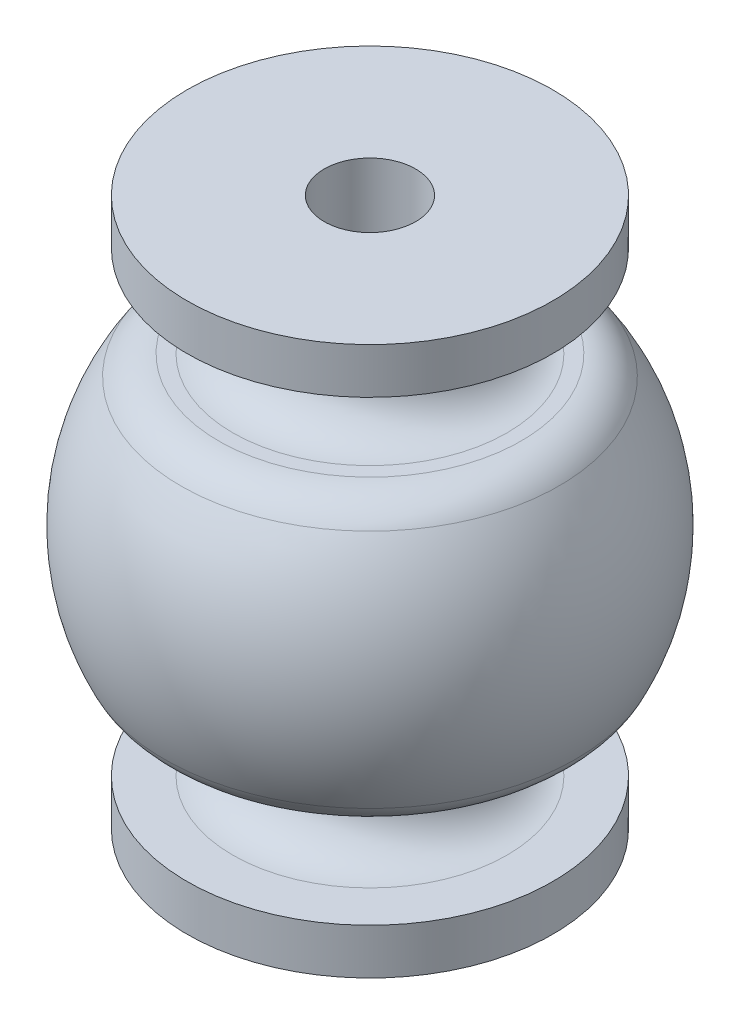
ISO-10303-21;
HEADER;
FILE_DESCRIPTION(('STEP AP214'),'2;1');
FILE_NAME('part.step','',(''),(''),'','','');
FILE_SCHEMA(('AUTOMOTIVE_DESIGN { 1 0 10303 214 1 1 1 1 }'));
ENDSEC;
DATA;
#1=APPLICATION_CONTEXT('core data for automotive mechanical design processes');
#2=APPLICATION_PROTOCOL_DEFINITION('international standard','automotive_design',2000,#1);
#3=PRODUCT_CONTEXT('',#1,'mechanical');
#4=PRODUCT('Part','Part','',(#3));
#5=PRODUCT_RELATED_PRODUCT_CATEGORY('part','',(#4));
#6=PRODUCT_DEFINITION_FORMATION('','',#4);
#7=PRODUCT_DEFINITION_CONTEXT('part definition',#1,'design');
#8=PRODUCT_DEFINITION('design','',#6,#7);
#9=PRODUCT_DEFINITION_SHAPE('','',#8);
#10=(LENGTH_UNIT() NAMED_UNIT(*) SI_UNIT(.MILLI.,.METRE.));
#11=(NAMED_UNIT(*) PLANE_ANGLE_UNIT() SI_UNIT($,.RADIAN.));
#12=(NAMED_UNIT(*) SI_UNIT($,.STERADIAN.) SOLID_ANGLE_UNIT());
#13=UNCERTAINTY_MEASURE_WITH_UNIT(LENGTH_MEASURE(1.E-05),#10,'distance_accuracy_value','');
#14=(GEOMETRIC_REPRESENTATION_CONTEXT(3) GLOBAL_UNCERTAINTY_ASSIGNED_CONTEXT((#13)) GLOBAL_UNIT_ASSIGNED_CONTEXT((#10,
#11,#12)) REPRESENTATION_CONTEXT('',''));
#15=CARTESIAN_POINT('',(0.,0.,0.));
#16=DIRECTION('',(0.,0.,1.));
#17=DIRECTION('',(1.,0.,0.));
#18=AXIS2_PLACEMENT_3D('',#15,#16,#17);
#19=CARTESIAN_POINT('',(0.,6.,0.));
#20=DIRECTION('',(0.,1.,0.));
#21=DIRECTION('',(-1.,0.,0.));
#22=AXIS2_PLACEMENT_3D('',#19,#20,#21);
#23=CYLINDRICAL_SURFACE('',#22,4.);
#24=CARTESIAN_POINT('',(0.,5.,0.));
#25=DIRECTION('',(0.,1.,0.));
#26=DIRECTION('',(-1.,0.,0.));
#27=AXIS2_PLACEMENT_3D('',#24,#25,#26);
#28=CIRCLE('',#27,4.);
#29=CARTESIAN_POINT('',(-4.,5.,0.));
#30=VERTEX_POINT('',#29);
#31=EDGE_CURVE('E128',#30,#30,#28,.T.);
#32=ORIENTED_EDGE('',*,*,#31,.T.);
#33=EDGE_LOOP('',(#32));
#34=FACE_BOUND('',#33,.T.);
#35=CARTESIAN_POINT('',(0.,6.,0.));
#36=DIRECTION('',(0.,1.,0.));
#37=DIRECTION('',(-1.,0.,0.));
#38=AXIS2_PLACEMENT_3D('',#35,#36,#37);
#39=CIRCLE('',#38,4.);
#40=CARTESIAN_POINT('',(-4.,6.,0.));
#41=VERTEX_POINT('',#40);
#42=EDGE_CURVE('E59',#41,#41,#39,.T.);
#43=ORIENTED_EDGE('',*,*,#42,.F.);
#44=EDGE_LOOP('',(#43));
#45=FACE_BOUND('',#44,.T.);
#46=ADVANCED_FACE('F41',(#34,#45),#23,.T.);
#47=CARTESIAN_POINT('',(0.,5.,0.));
#48=DIRECTION('',(0.,-1.,0.));
#49=DIRECTION('',(1.,0.,0.));
#50=AXIS2_PLACEMENT_3D('',#47,#48,#49);
#51=PLANE('',#50);
#52=CARTESIAN_POINT('',(0.,5.,0.));
#53=DIRECTION('',(0.,-1.,0.));
#54=DIRECTION('',(1.,0.,0.));
#55=AXIS2_PLACEMENT_3D('',#52,#53,#54);
#56=CIRCLE('',#55,3.);
#57=CARTESIAN_POINT('',(3.,5.,0.));
#58=VERTEX_POINT('',#57);
#59=EDGE_CURVE('E10',#58,#58,#56,.F.);
#60=ORIENTED_EDGE('',*,*,#59,.T.);
#61=EDGE_LOOP('',(#60));
#62=FACE_BOUND('',#61,.T.);
#63=ORIENTED_EDGE('',*,*,#31,.F.);
#64=EDGE_LOOP('',(#63));
#65=FACE_BOUND('',#64,.T.);
#66=ADVANCED_FACE('F82',(#62,#65),#51,.T.);
#67=CARTESIAN_POINT('',(0.,3.,0.));
#68=DIRECTION('',(0.,1.,0.));
#69=DIRECTION('',(-1.,0.,0.));
#70=AXIS2_PLACEMENT_3D('',#67,#68,#69);
#71=PLANE('',#70);
#72=CARTESIAN_POINT('',(0.,3.,0.));
#73=DIRECTION('',(0.,1.,0.));
#74=DIRECTION('',(-1.,0.,0.));
#75=AXIS2_PLACEMENT_3D('',#72,#73,#74);
#76=CIRCLE('',#75,3.3090727428555);
#77=CARTESIAN_POINT('',(-3.3090727428555,3.,0.));
#78=VERTEX_POINT('',#77);
#79=EDGE_CURVE('E49',#78,#78,#76,.T.);
#80=ORIENTED_EDGE('',*,*,#79,.T.);
#81=EDGE_LOOP('',(#80));
#82=FACE_BOUND('',#81,.T.);
#83=CARTESIAN_POINT('',(0.,3.,0.));
#84=DIRECTION('',(0.,1.,0.));
#85=DIRECTION('',(-1.,0.,0.));
#86=AXIS2_PLACEMENT_3D('',#83,#84,#85);
#87=CIRCLE('',#86,3.);
#88=CARTESIAN_POINT('',(-3.,3.,0.));
#89=VERTEX_POINT('',#88);
#90=EDGE_CURVE('E54',#89,#89,#87,.F.);
#91=ORIENTED_EDGE('',*,*,#90,.T.);
#92=EDGE_LOOP('',(#91));
#93=FACE_BOUND('',#92,.T.);
#94=ADVANCED_FACE('F88',(#82,#93),#71,.T.);
#95=CARTESIAN_POINT('',(0.,-0.247228867403314,0.));
#96=DIRECTION('',(0.,1.,0.));
#97=DIRECTION('',(-1.,0.,0.));
#98=AXIS2_PLACEMENT_3D('',#95,#96,#97);
#99=SPHERICAL_SURFACE('',#98,5.);
#100=CARTESIAN_POINT('',(0.,-2.43819278314917,0.));
#101=DIRECTION('',(0.,1.,0.));
#102=DIRECTION('',(-1.,0.,0.));
#103=AXIS2_PLACEMENT_3D('',#100,#101,#102);
#104=CIRCLE('',#103,4.49440509076558);
#105=CARTESIAN_POINT('',(-4.49440509076558,-2.43819278314917,0.));
#106=VERTEX_POINT('',#105);
#107=EDGE_CURVE('E113',#106,#106,#104,.T.);
#108=CARTESIAN_POINT('',(0.,2.56180721685083,0.));
#109=DIRECTION('',(0.,-1.,0.));
#110=DIRECTION('',(1.,0.,0.));
#111=AXIS2_PLACEMENT_3D('',#108,#109,#110);
#112=CIRCLE('',#111,4.13634092856937);
#113=CARTESIAN_POINT('',(-4.13634092856938,2.56180721685083,0.));
#114=VERTEX_POINT('',#113);
#115=EDGE_CURVE('E115',#114,#114,#112,.T.);
#116=CARTESIAN_POINT('',(-4.49440509076558,-2.43819278314917,0.));
#117=CARTESIAN_POINT('',(-4.51837263355739,-2.38902807033168,0.));
#118=CARTESIAN_POINT('',(-4.54153282449755,-2.33946980595294,0.));
#119=CARTESIAN_POINT('',(-4.58621495323902,-2.23962016517865,0.));
#120=CARTESIAN_POINT('',(-4.60773689104033,-2.1893287887831,0.));
#121=CARTESIAN_POINT('',(-4.64911896406856,-2.08806691508092,0.));
#122=CARTESIAN_POINT('',(-4.66897909929548,-2.03709641777429,0.));
#123=CARTESIAN_POINT('',(-4.7070162800247,-1.93453123622906,0.));
#124=CARTESIAN_POINT('',(-4.72519332552701,-1.88293655199047,0.));
#125=CARTESIAN_POINT('',(-4.75984472548355,-1.7791785460551,0.));
#126=CARTESIAN_POINT('',(-4.77631907993779,-1.72701522435832,0.));
#127=CARTESIAN_POINT('',(-4.80754736401386,-1.62217612052433,0.));
#128=CARTESIAN_POINT('',(-4.8223012936357,-1.56950033838713,0.));
#129=CARTESIAN_POINT('',(-4.85007283786525,-1.46369303848059,0.));
#130=CARTESIAN_POINT('',(-4.86309045247297,-1.41056152071124,0.));
#131=CARTESIAN_POINT('',(-4.8873753487379,-1.30389996621321,0.));
#132=CARTESIAN_POINT('',(-4.89864263039512,-1.25036992948451,0.));
#133=CARTESIAN_POINT('',(-4.91941472707402,-1.14296898260678,0.));
#134=CARTESIAN_POINT('',(-4.9289195420957,-1.08909807245774,0.));
#135=CARTESIAN_POINT('',(-4.94615646996424,-0.981073391437501,0.));
#136=CARTESIAN_POINT('',(-4.95388858281111,-0.926919620566298,0.));
#137=CARTESIAN_POINT('',(-4.9675717797372,-0.818387535386904,0.));
#138=CARTESIAN_POINT('',(-4.97352286381642,-0.764009221078713,0.));
#139=CARTESIAN_POINT('',(-4.98363759458702,-0.655086608123216,0.));
#140=CARTESIAN_POINT('',(-4.98780124127839,-0.600542309475909,0.));
#141=CARTESIAN_POINT('',(-4.99433661351114,-0.491346465684298,0.));
#142=CARTESIAN_POINT('',(-4.9967083390525,-0.436694920539994,0.));
#143=CARTESIAN_POINT('',(-4.99965731491388,-0.327343437088873,0.));
#144=CARTESIAN_POINT('',(-5.00023456523389,-0.272643498782055,0.));
#145=CARTESIAN_POINT('',(-4.99959396902129,-0.163254134454066,0.));
#146=CARTESIAN_POINT('',(-4.99837612248868,-0.108564708432895,0.));
#147=CARTESIAN_POINT('',(-4.9941466440494,0.000744737196115423,0.));
#148=CARTESIAN_POINT('',(-4.99113501214273,0.0553647568039547,0.));
#149=CARTESIAN_POINT('',(-4.98332120613134,0.164476570221228,0.));
#150=CARTESIAN_POINT('',(-4.97851903202661,0.218968364030663,0.));
#151=CARTESIAN_POINT('',(-4.96712931300004,0.327765044550271,0.));
#152=CARTESIAN_POINT('',(-4.96054176807819,0.382069931260444,0.));
#153=CARTESIAN_POINT('',(-4.94558840143424,0.490434317557792,0.));
#154=CARTESIAN_POINT('',(-4.93722257971214,0.544493817144966,0.));
#155=CARTESIAN_POINT('',(-4.91872166848116,0.652309213425902,0.));
#156=CARTESIAN_POINT('',(-4.90858657897228,0.706065110119663,0.));
#157=CARTESIAN_POINT('',(-4.88655804647583,0.813215411788092,0.));
#158=CARTESIAN_POINT('',(-4.87466460348827,0.866609816762759,0.));
#159=CARTESIAN_POINT('',(-4.84913217188484,0.972979635452232,0.));
#160=CARTESIAN_POINT('',(-4.83549318326898,1.02595504916704,0.));
#161=CARTESIAN_POINT('',(-4.8064843480051,1.13142983699872,0.));
#162=CARTESIAN_POINT('',(-4.79111450135709,1.1839292111156,0.));
#163=CARTESIAN_POINT('',(-4.75866050156871,1.28839538405979,0.));
#164=CARTESIAN_POINT('',(-4.74157634842836,1.34036218288711,0.));
#165=CARTESIAN_POINT('',(-4.7057121332597,1.44370724305453,0.));
#166=CARTESIAN_POINT('',(-4.68693207123139,1.49508550439463,0.));
#167=CARTESIAN_POINT('',(-4.64769626234913,1.59719816127853,0.));
#168=CARTESIAN_POINT('',(-4.62724051549517,1.64793255682234,0.));
#169=CARTESIAN_POINT('',(-4.5846753649362,1.74870284679067,0.));
#170=CARTESIAN_POINT('',(-4.5625659612312,1.79873874121518,0.));
#171=CARTESIAN_POINT('',(-4.51671730799666,1.89805814725261,0.));
#172=CARTESIAN_POINT('',(-4.49297805846712,1.94734165886553,0.));
#173=CARTESIAN_POINT('',(-4.44389527134232,2.04510322249201,0.));
#174=CARTESIAN_POINT('',(-4.41855173374705,2.09358127450557,0.));
#175=CARTESIAN_POINT('',(-4.36628768730966,2.18967972940066,0.));
#176=CARTESIAN_POINT('',(-4.33936717846753,2.23730013228218,0.));
#177=CARTESIAN_POINT('',(-4.28397808727426,2.33163194881601,0.));
#178=CARTESIAN_POINT('',(-4.25550950492311,2.37834336246833,0.));
#179=CARTESIAN_POINT('',(-4.1970552692949,2.47080711606262,0.));
#180=CARTESIAN_POINT('',(-4.16706961601784,2.51655945600459,0.));
#181=CARTESIAN_POINT('',(-4.13634092856938,2.56180721685083,0.));
#182=B_SPLINE_CURVE_WITH_KNOTS('',3,(#116,#117,#118,#119,#120,#121,#122,#123,#124,#125,#126,
#127,#128,#129,#130,#131,#132,#133,#134,#135,#136,#137,#138,#139,#140,#141,#142,#143,#144,#145,
#146,#147,#148,#149,#150,#151,#152,#153,#154,#155,#156,#157,#158,#159,#160,#161,#162,#163,#164,
#165,#166,#167,#168,#169,#170,#171,#172,#173,#174,#175,#176,#177,#178,#179,#180,#181),
.UNSPECIFIED.,.F.,.F.,(4,2,2,2,2,2,2,2,2,2,2,2,2,2,2,2,2,2,2,2,2,2,2,2,2,2,2,2,2,2,2,2,4),(0.,
0.164079497915561,0.328158995831123,0.492238493746684,0.656317991662244,0.820397489577806,
0.984476987493367,1.14855648540893,1.31263598332449,1.47671548124005,1.64079497915561,
1.80487447707117,1.96895397498673,2.13303347290229,2.29711297081786,2.46119246873342,
2.62527196664898,2.78935146456454,2.9534309624801,3.11751046039566,3.28158995831122,
3.44566945622678,3.60974895414235,3.77382845205791,3.93790794997347,4.10198744788903,
4.26606694580459,4.43014644372015,4.59422594163571,4.75830543955127,4.92238493746684,
5.0864644353824,5.25054393329796),.UNSPECIFIED.);
#183=EDGE_CURVE('BSEAM217',#106,#114,#182,.T.);
#184=ORIENTED_EDGE('',*,*,#107,.T.);
#185=ORIENTED_EDGE('',*,*,#115,.T.);
#186=ORIENTED_EDGE('',*,*,#183,.T.);
#187=ORIENTED_EDGE('',*,*,#183,.F.);
#188=EDGE_LOOP('',(#184,#186,#185,#187));
#189=FACE_BOUND('',#188,.T.);
#190=ADVANCED_FACE('F217',(#189),#99,.T.);
#191=CARTESIAN_POINT('',(0.,-3.,0.));
#192=DIRECTION('',(0.,1.,0.));
#193=DIRECTION('',(-1.,0.,0.));
#194=AXIS2_PLACEMENT_3D('',#191,#192,#193);
#195=PLANE('',#194);
#196=CARTESIAN_POINT('',(0.,-3.,0.));
#197=DIRECTION('',(0.,1.,0.));
#198=DIRECTION('',(-1.,0.,0.));
#199=AXIS2_PLACEMENT_3D('',#196,#197,#198);
#200=CIRCLE('',#199,3.);
#201=CARTESIAN_POINT('',(-3.,-3.,0.));
#202=VERTEX_POINT('',#201);
#203=EDGE_CURVE('E119',#202,#202,#200,.T.);
#204=ORIENTED_EDGE('',*,*,#203,.T.);
#205=EDGE_LOOP('',(#204));
#206=FACE_BOUND('',#205,.T.);
#207=CARTESIAN_POINT('',(0.,-3.,0.));
#208=DIRECTION('',(0.,1.,0.));
#209=DIRECTION('',(-1.,0.,0.));
#210=AXIS2_PLACEMENT_3D('',#207,#208,#209);
#211=CIRCLE('',#210,3.59552407261247);
#212=CARTESIAN_POINT('',(-3.59552407261247,-3.,0.));
#213=VERTEX_POINT('',#212);
#214=EDGE_CURVE('E110',#213,#213,#211,.F.);
#215=ORIENTED_EDGE('',*,*,#214,.T.);
#216=EDGE_LOOP('',(#215));
#217=FACE_BOUND('',#216,.T.);
#218=ADVANCED_FACE('F213',(#206,#217),#195,.F.);
#219=CARTESIAN_POINT('',(0.,-5.,0.));
#220=DIRECTION('',(0.,-1.,0.));
#221=DIRECTION('',(1.,0.,0.));
#222=AXIS2_PLACEMENT_3D('',#219,#220,#221);
#223=PLANE('',#222);
#224=CARTESIAN_POINT('',(0.,-5.,0.));
#225=DIRECTION('',(0.,-1.,0.));
#226=DIRECTION('',(1.,0.,0.));
#227=AXIS2_PLACEMENT_3D('',#224,#225,#226);
#228=CIRCLE('',#227,3.);
#229=CARTESIAN_POINT('',(3.,-5.,0.));
#230=VERTEX_POINT('',#229);
#231=EDGE_CURVE('E125',#230,#230,#228,.T.);
#232=ORIENTED_EDGE('',*,*,#231,.T.);
#233=EDGE_LOOP('',(#232));
#234=FACE_BOUND('',#233,.T.);
#235=CARTESIAN_POINT('',(0.,-5.,0.));
#236=DIRECTION('',(0.,1.,0.));
#237=DIRECTION('',(-1.,0.,0.));
#238=AXIS2_PLACEMENT_3D('',#235,#236,#237);
#239=CIRCLE('',#238,4.);
#240=CARTESIAN_POINT('',(-4.,-5.,0.));
#241=VERTEX_POINT('',#240);
#242=EDGE_CURVE('E130',#241,#241,#239,.T.);
#243=ORIENTED_EDGE('',*,*,#242,.T.);
#244=EDGE_LOOP('',(#243));
#245=FACE_BOUND('',#244,.T.);
#246=ADVANCED_FACE('F209',(#234,#245),#223,.F.);
#247=CARTESIAN_POINT('',(0.,6.,0.));
#248=DIRECTION('',(0.,1.,0.));
#249=DIRECTION('',(-1.,0.,0.));
#250=AXIS2_PLACEMENT_3D('',#247,#248,#249);
#251=CYLINDRICAL_SURFACE('',#250,4.);
#252=ORIENTED_EDGE('',*,*,#242,.F.);
#253=EDGE_LOOP('',(#252));
#254=FACE_BOUND('',#253,.T.);
#255=CARTESIAN_POINT('',(0.,-6.,0.));
#256=DIRECTION('',(0.,1.,0.));
#257=DIRECTION('',(-1.,0.,0.));
#258=AXIS2_PLACEMENT_3D('',#255,#256,#257);
#259=CIRCLE('',#258,4.);
#260=CARTESIAN_POINT('',(-4.,-6.,0.));
#261=VERTEX_POINT('',#260);
#262=EDGE_CURVE('E133',#261,#261,#259,.T.);
#263=ORIENTED_EDGE('',*,*,#262,.T.);
#264=EDGE_LOOP('',(#263));
#265=FACE_BOUND('',#264,.T.);
#266=ADVANCED_FACE('F205',(#254,#265),#251,.T.);
#267=CARTESIAN_POINT('',(0.,-6.,0.));
#268=DIRECTION('',(0.,-1.,0.));
#269=DIRECTION('',(1.,0.,0.));
#270=AXIS2_PLACEMENT_3D('',#267,#268,#269);
#271=PLANE('',#270);
#272=CARTESIAN_POINT('',(0.,-6.,0.));
#273=DIRECTION('',(0.,1.,0.));
#274=DIRECTION('',(-1.,0.,0.));
#275=AXIS2_PLACEMENT_3D('',#272,#273,#274);
#276=CIRCLE('',#275,1.);
#277=CARTESIAN_POINT('',(-1.,-6.,0.));
#278=VERTEX_POINT('',#277);
#279=EDGE_CURVE('E136',#278,#278,#276,.T.);
#280=ORIENTED_EDGE('',*,*,#279,.T.);
#281=EDGE_LOOP('',(#280));
#282=FACE_BOUND('',#281,.T.);
#283=ORIENTED_EDGE('',*,*,#262,.F.);
#284=EDGE_LOOP('',(#283));
#285=FACE_BOUND('',#284,.T.);
#286=ADVANCED_FACE('F201',(#282,#285),#271,.T.);
#287=CARTESIAN_POINT('',(0.,6.,0.));
#288=DIRECTION('',(0.,1.,0.));
#289=DIRECTION('',(-1.,0.,0.));
#290=AXIS2_PLACEMENT_3D('',#287,#288,#289);
#291=CYLINDRICAL_SURFACE('',#290,1.);
#292=CARTESIAN_POINT('',(0.,-5.14620835296967,0.));
#293=DIRECTION('',(0.,1.,0.));
#294=DIRECTION('',(-1.,0.,0.));
#295=AXIS2_PLACEMENT_3D('',#292,#293,#294);
#296=CIRCLE('',#295,1.);
#297=CARTESIAN_POINT('',(-1.,-5.14620835296967,0.));
#298=VERTEX_POINT('',#297);
#299=EDGE_CURVE('E139',#298,#298,#296,.T.);
#300=ORIENTED_EDGE('',*,*,#299,.T.);
#301=EDGE_LOOP('',(#300));
#302=FACE_BOUND('',#301,.T.);
#303=ORIENTED_EDGE('',*,*,#279,.F.);
#304=EDGE_LOOP('',(#303));
#305=FACE_BOUND('',#304,.T.);
#306=ADVANCED_FACE('F197',(#302,#305),#291,.F.);
#307=CARTESIAN_POINT('',(0.,-0.247228867403314,0.));
#308=DIRECTION('',(0.,1.,0.));
#309=DIRECTION('',(-1.,0.,0.));
#310=AXIS2_PLACEMENT_3D('',#307,#308,#309);
#311=SPHERICAL_SURFACE('',#310,5.);
#312=CARTESIAN_POINT('',(0.,-5.,0.));
#313=DIRECTION('',(0.,1.,0.));
#314=DIRECTION('',(-1.,0.,0.));
#315=AXIS2_PLACEMENT_3D('',#312,#313,#314);
#316=CIRCLE('',#315,1.55279314821893);
#317=CARTESIAN_POINT('',(-1.55279314821892,-5.,0.));
#318=VERTEX_POINT('',#317);
#319=EDGE_CURVE('E142',#318,#318,#316,.T.);
#320=CARTESIAN_POINT('',(-1.,-5.14620835296967,0.));
#321=CARTESIAN_POINT('',(-1.00583911119429,-5.14501644943815,0.));
#322=CARTESIAN_POINT('',(-1.01167609141785,-5.14381410632627,0.));
#323=CARTESIAN_POINT('',(-1.02334571533741,-5.14138855652494,0.));
#324=CARTESIAN_POINT('',(-1.0291783590334,-5.14016534983549,0.));
#325=CARTESIAN_POINT('',(-1.0408392353117,-5.13769808846221,0.));
#326=CARTESIAN_POINT('',(-1.04666746789401,-5.13645403377838,0.));
#327=CARTESIAN_POINT('',(-1.0583194474301,-5.13394509233754,0.));
#328=CARTESIAN_POINT('',(-1.06414319438387,-5.13268020558053,0.));
#329=CARTESIAN_POINT('',(-1.07578612820139,-5.13012961616174,0.));
#330=CARTESIAN_POINT('',(-1.08160531506514,-5.12884391349995,0.));
#331=CARTESIAN_POINT('',(-1.0932390543005,-5.1262517087113,0.));
#332=CARTESIAN_POINT('',(-1.09905360667211,-5.12494520658443,0.));
#333=CARTESIAN_POINT('',(-1.11067800258004,-5.12231141956985,0.));
#334=CARTESIAN_POINT('',(-1.11648784611636,-5.12098413468214,0.));
#335=CARTESIAN_POINT('',(-1.12810275007086,-5.11830879911621,0.));
#336=CARTESIAN_POINT('',(-1.13390781048904,-5.11696074843799,0.));
#337=CARTESIAN_POINT('',(-1.14551307398551,-5.11424389852679,0.));
#338=CARTESIAN_POINT('',(-1.15131327706381,-5.11287509929381,0.));
#339=CARTESIAN_POINT('',(-1.16290875172091,-5.11011676977414,0.));
#340=CARTESIAN_POINT('',(-1.16870402329971,-5.10872723948744,0.));
#341=CARTESIAN_POINT('',(-1.18028956086125,-5.10592746562646,0.));
#342=CARTESIAN_POINT('',(-1.18607982684399,-5.10451722205216,0.));
#343=CARTESIAN_POINT('',(-1.19765527918084,-5.10167603964691,0.));
#344=CARTESIAN_POINT('',(-1.20344046553495,-5.10024510081595,0.));
#345=CARTESIAN_POINT('',(-1.21500568464692,-5.09736254619293,0.));
#346=CARTESIAN_POINT('',(-1.22078571740478,-5.09591093040085,0.));
#347=CARTESIAN_POINT('',(-1.23234055542252,-5.09298704041551,0.));
#348=CARTESIAN_POINT('',(-1.2381153606824,-5.09151476622224,0.));
#349=CARTESIAN_POINT('',(-1.24965966986929,-5.08854957825854,0.));
#350=CARTESIAN_POINT('',(-1.2554291737963,-5.08705666448811,0.));
#351=CARTESIAN_POINT('',(-1.26696280655034,-5.08405021645805,0.));
#352=CARTESIAN_POINT('',(-1.27272693537737,-5.08253668219841,0.));
#353=CARTESIAN_POINT('',(-1.28424974423306,-5.0794890125415,0.));
#354=CARTESIAN_POINT('',(-1.29000842426173,-5.07795487714423,0.));
#355=CARTESIAN_POINT('',(-1.30152026189198,-5.07486602482704,0.));
#356=CARTESIAN_POINT('',(-1.30727341949356,-5.07331130790712,0.));
#357=CARTESIAN_POINT('',(-1.31877413871153,-5.07018131242278,0.));
#358=CARTESIAN_POINT('',(-1.32452170032791,-5.06860603385835,0.));
#359=CARTESIAN_POINT('',(-1.33601115408893,-5.06543493522602,0.));
#360=CARTESIAN_POINT('',(-1.34175304623356,-5.06383911515811,0.));
#361=CARTESIAN_POINT('',(-1.35323108763699,-5.06062695392248,0.));
#362=CARTESIAN_POINT('',(-1.35896723689579,-5.05901061275476,0.));
#363=CARTESIAN_POINT('',(-1.37043371918692,-5.05575742998554,0.));
#364=CARTESIAN_POINT('',(-1.37616405221924,-5.05412058838405,0.));
#365=CARTESIAN_POINT('',(-1.38761882879112,-5.05082642567544,0.));
#366=CARTESIAN_POINT('',(-1.39334327233069,-5.04916910456833,0.));
#367=CARTESIAN_POINT('',(-1.40478619672607,-5.04583400403849,0.));
#368=CARTESIAN_POINT('',(-1.41050467758189,-5.04415622461576,0.));
#369=CARTESIAN_POINT('',(-1.42193560349504,-5.04078022890626,0.));
#370=CARTESIAN_POINT('',(-1.42764804855237,-5.03908201261949,0.));
#371=CARTESIAN_POINT('',(-1.43906682983098,-5.03566516489478,0.));
#372=CARTESIAN_POINT('',(-1.44477316605226,-5.03394653345686,0.));
#373=CARTESIAN_POINT('',(-1.45617965669928,-5.03048887740367,0.));
#374=CARTESIAN_POINT('',(-1.46187981112501,-5.0287498527884,0.));
#375=CARTESIAN_POINT('',(-1.4732738653006,-5.02525143261546,0.));
#376=CARTESIAN_POINT('',(-1.47896776505045,-5.02349203705779,0.));
#377=CARTESIAN_POINT('',(-1.49034923707347,-5.01995289749405,0.));
#378=CARTESIAN_POINT('',(-1.49603680934664,-5.018173153488,0.));
#379=CARTESIAN_POINT('',(-1.50740555369802,-5.01459333978671,0.));
#380=CARTESIAN_POINT('',(-1.51308672577622,-5.01279327009147,0.));
#381=CARTESIAN_POINT('',(-1.5244425970952,-5.00917282801227,0.));
#382=CARTESIAN_POINT('',(-1.53011729633597,-5.00735245562831,0.));
#383=CARTESIAN_POINT('',(-1.5414601494428,-5.00369143150118,0.));
#384=CARTESIAN_POINT('',(-1.54712830330886,-5.00185077975801,0.));
#385=CARTESIAN_POINT('',(-1.55279314821892,-5.,0.));
#386=B_SPLINE_CURVE_WITH_KNOTS('',3,(#320,#321,#322,#323,#324,#325,#326,#327,#328,#329,#330,
#331,#332,#333,#334,#335,#336,#337,#338,#339,#340,#341,#342,#343,#344,#345,#346,#347,#348,#349,
#350,#351,#352,#353,#354,#355,#356,#357,#358,#359,#360,#361,#362,#363,#364,#365,#366,#367,#368,
#369,#370,#371,#372,#373,#374,#375,#376,#377,#378,#379,#380,#381,#382,#383,#384,#385),
.UNSPECIFIED.,.F.,.F.,(4,2,2,2,2,2,2,2,2,2,2,2,2,2,2,2,2,2,2,2,2,2,2,2,2,2,2,2,2,2,2,2,4),(0.,
0.0178785441666818,0.0357570883333648,0.0536356325000476,0.0715141766667298,0.0893927208334113,
0.107271265000094,0.125149809166777,0.143028353333459,0.160906897500141,0.178785441666824,
0.196663985833507,0.214542530000189,0.232421074166871,0.250299618333554,0.268178162500237,
0.286056706666919,0.303935250833601,0.321813795000284,0.339692339166967,0.357570883333649,
0.375449427500331,0.393327971667014,0.411206515833697,0.429085060000379,0.44696360416706,
0.464842148333743,0.482720692500427,0.500599236667108,0.51847778083379,0.536356325000473,
0.554234869167156,0.572113413333838),.UNSPECIFIED.);
#387=EDGE_CURVE('BSEAM193',#298,#318,#386,.T.);
#388=ORIENTED_EDGE('',*,*,#299,.F.);
#389=ORIENTED_EDGE('',*,*,#319,.T.);
#390=ORIENTED_EDGE('',*,*,#387,.T.);
#391=ORIENTED_EDGE('',*,*,#387,.F.);
#392=EDGE_LOOP('',(#388,#390,#389,#391));
#393=FACE_BOUND('',#392,.T.);
#394=ADVANCED_FACE('F193',(#393),#311,.F.);
#395=CARTESIAN_POINT('',(0.,-5.,0.));
#396=DIRECTION('',(0.,-1.,0.));
#397=DIRECTION('',(1.,0.,0.));
#398=AXIS2_PLACEMENT_3D('',#395,#396,#397);
#399=PLANE('',#398);
#400=CARTESIAN_POINT('',(0.,-5.,0.));
#401=DIRECTION('',(0.,1.,0.));
#402=DIRECTION('',(-1.,0.,0.));
#403=AXIS2_PLACEMENT_3D('',#400,#401,#402);
#404=CIRCLE('',#403,1.);
#405=CARTESIAN_POINT('',(-1.,-5.,0.));
#406=VERTEX_POINT('',#405);
#407=EDGE_CURVE('E145',#406,#406,#404,.T.);
#408=ORIENTED_EDGE('',*,*,#407,.T.);
#409=EDGE_LOOP('',(#408));
#410=FACE_BOUND('',#409,.T.);
#411=ORIENTED_EDGE('',*,*,#319,.F.);
#412=EDGE_LOOP('',(#411));
#413=FACE_BOUND('',#412,.T.);
#414=ADVANCED_FACE('F189',(#410,#413),#399,.T.);
#415=CARTESIAN_POINT('',(0.,6.,0.));
#416=DIRECTION('',(0.,1.,0.));
#417=DIRECTION('',(-1.,0.,0.));
#418=AXIS2_PLACEMENT_3D('',#415,#416,#417);
#419=CYLINDRICAL_SURFACE('',#418,1.);
#420=CARTESIAN_POINT('',(0.,-2.,0.));
#421=DIRECTION('',(0.,1.,0.));
#422=DIRECTION('',(-1.,0.,0.));
#423=AXIS2_PLACEMENT_3D('',#420,#421,#422);
#424=CIRCLE('',#423,1.);
#425=CARTESIAN_POINT('',(-1.,-2.,0.));
#426=VERTEX_POINT('',#425);
#427=EDGE_CURVE('E148',#426,#426,#424,.T.);
#428=ORIENTED_EDGE('',*,*,#427,.T.);
#429=EDGE_LOOP('',(#428));
#430=FACE_BOUND('',#429,.T.);
#431=ORIENTED_EDGE('',*,*,#407,.F.);
#432=EDGE_LOOP('',(#431));
#433=FACE_BOUND('',#432,.T.);
#434=ADVANCED_FACE('F185',(#430,#433),#419,.F.);
#435=CARTESIAN_POINT('',(0.,-2.,0.));
#436=DIRECTION('',(0.,1.,0.));
#437=DIRECTION('',(-1.,0.,0.));
#438=AXIS2_PLACEMENT_3D('',#435,#436,#437);
#439=PLANE('',#438);
#440=CARTESIAN_POINT('',(0.,-2.,0.));
#441=DIRECTION('',(0.,1.,0.));
#442=DIRECTION('',(-1.,0.,0.));
#443=AXIS2_PLACEMENT_3D('',#440,#441,#442);
#444=CIRCLE('',#443,3.59552407261247);
#445=CARTESIAN_POINT('',(-3.59552407261247,-2.,0.));
#446=VERTEX_POINT('',#445);
#447=EDGE_CURVE('E151',#446,#446,#444,.T.);
#448=ORIENTED_EDGE('',*,*,#447,.T.);
#449=EDGE_LOOP('',(#448));
#450=FACE_BOUND('',#449,.T.);
#451=ORIENTED_EDGE('',*,*,#427,.F.);
#452=EDGE_LOOP('',(#451));
#453=FACE_BOUND('',#452,.T.);
#454=ADVANCED_FACE('F181',(#450,#453),#439,.T.);
#455=CARTESIAN_POINT('',(0.,-0.247228867403314,0.));
#456=DIRECTION('',(0.,1.,0.));
#457=DIRECTION('',(-1.,0.,0.));
#458=AXIS2_PLACEMENT_3D('',#455,#456,#457);
#459=SPHERICAL_SURFACE('',#458,4.);
#460=CARTESIAN_POINT('',(0.,2.,0.));
#461=DIRECTION('',(0.,1.,0.));
#462=DIRECTION('',(-1.,0.,0.));
#463=AXIS2_PLACEMENT_3D('',#460,#461,#462);
#464=CIRCLE('',#463,3.3090727428555);
#465=CARTESIAN_POINT('',(-3.3090727428555,2.,0.));
#466=VERTEX_POINT('',#465);
#467=EDGE_CURVE('E154',#466,#466,#464,.T.);
#468=CARTESIAN_POINT('',(-3.59552407261247,-2.,0.));
#469=CARTESIAN_POINT('',(-3.61469810684591,-1.96066822974601,0.));
#470=CARTESIAN_POINT('',(-3.63322625959804,-1.92102161824301,0.));
#471=CARTESIAN_POINT('',(-3.66897196259122,-1.84114190562358,0.));
#472=CARTESIAN_POINT('',(-3.68618951283227,-1.80090880450714,0.));
#473=CARTESIAN_POINT('',(-3.71929517125485,-1.7198993055454,0.));
#474=CARTESIAN_POINT('',(-3.73518327943639,-1.67912290770009,0.));
#475=CARTESIAN_POINT('',(-3.76561302401976,-1.59707076246391,0.));
#476=CARTESIAN_POINT('',(-3.78015466042161,-1.55579501507304,0.));
#477=CARTESIAN_POINT('',(-3.80787578038684,-1.47278861032474,0.));
#478=CARTESIAN_POINT('',(-3.82105526395023,-1.43105795296731,0.));
#479=CARTESIAN_POINT('',(-3.84603789121109,-1.34718666990013,0.));
#480=CARTESIAN_POINT('',(-3.85784103490856,-1.30504604419037,0.));
#481=CARTESIAN_POINT('',(-3.8800582702922,-1.22040020426513,0.));
#482=CARTESIAN_POINT('',(-3.89047236197838,-1.17789499004966,0.));
#483=CARTESIAN_POINT('',(-3.90990027899032,-1.09256574645123,0.));
#484=CARTESIAN_POINT('',(-3.9189141043161,-1.04974171706827,0.));
#485=CARTESIAN_POINT('',(-3.93553178165922,-0.963820959566086,0.));
#486=CARTESIAN_POINT('',(-3.94313563367656,-0.920724231446856,0.));
#487=CARTESIAN_POINT('',(-3.95692517597139,-0.834304486630663,0.));
#488=CARTESIAN_POINT('',(-3.96311086624889,-0.7909814699337,0.));
#489=CARTESIAN_POINT('',(-3.97405742378976,-0.704155801790185,0.));
#490=CARTESIAN_POINT('',(-3.97881829105314,-0.660653150343633,0.));
#491=CARTESIAN_POINT('',(-3.98691007566961,-0.573515059979235,0.));
#492=CARTESIAN_POINT('',(-3.99024099302271,-0.529879621061389,0.));
#493=CARTESIAN_POINT('',(-3.99546929080891,-0.4425229460281,0.));
#494=CARTESIAN_POINT('',(-3.997366671242,-0.398801709912658,0.));
#495=CARTESIAN_POINT('',(-3.9997258519311,-0.311320523151761,0.));
#496=CARTESIAN_POINT('',(-4.00018765218711,-0.267560572506306,0.));
#497=CARTESIAN_POINT('',(-3.99967517521703,-0.180049081043915,0.));
#498=CARTESIAN_POINT('',(-3.99870089799094,-0.136297540226978,0.));
#499=CARTESIAN_POINT('',(-3.99531731523952,-0.0488499837237701,0.));
#500=CARTESIAN_POINT('',(-3.99290800971418,-0.00515396803749868,0.));
#501=CARTESIAN_POINT('',(-3.98665696490507,0.0821354826963203,0.));
#502=CARTESIAN_POINT('',(-3.98281522562129,0.125728917743868,0.));
#503=CARTESIAN_POINT('',(-3.97370345040003,0.212766262159554,0.));
#504=CARTESIAN_POINT('',(-3.96843341446255,0.256210171527693,0.));
#505=CARTESIAN_POINT('',(-3.95647072114739,0.342901680565571,0.));
#506=CARTESIAN_POINT('',(-3.94977806376972,0.38614928023531,0.));
#507=CARTESIAN_POINT('',(-3.93497733478493,0.472401597260058,0.));
#508=CARTESIAN_POINT('',(-3.92686926317782,0.515406314615067,0.));
#509=CARTESIAN_POINT('',(-3.90924643718066,0.601126555949811,0.));
#510=CARTESIAN_POINT('',(-3.89973168279061,0.643842079929545,0.));
#511=CARTESIAN_POINT('',(-3.87930573750788,0.728937934881123,0.));
#512=CARTESIAN_POINT('',(-3.86839454661519,0.771318265852966,0.));
#513=CARTESIAN_POINT('',(-3.84518747840408,0.855698096118313,0.));
#514=CARTESIAN_POINT('',(-3.83289160108567,0.897697595411815,0.));
#515=CARTESIAN_POINT('',(-3.80692840125497,0.981270533767172,0.));
#516=CARTESIAN_POINT('',(-3.79326107874269,1.02284397282903,0.));
#517=CARTESIAN_POINT('',(-3.76456970660776,1.10552002096296,0.));
#518=CARTESIAN_POINT('',(-3.74954565698512,1.14662263003504,0.));
#519=CARTESIAN_POINT('',(-3.7181570098793,1.22831275554216,0.));
#520=CARTESIAN_POINT('',(-3.70179241239613,1.26890027197721,0.));
#521=CARTESIAN_POINT('',(-3.66774029194896,1.34951650395187,0.));
#522=CARTESIAN_POINT('',(-3.65005276898496,1.38954521949148,0.));
#523=CARTESIAN_POINT('',(-3.61337384639733,1.46900074432143,0.));
#524=CARTESIAN_POINT('',(-3.5943824467737,1.50842755361176,0.));
#525=CARTESIAN_POINT('',(-3.55511621707385,1.58663680451294,0.));
#526=CARTESIAN_POINT('',(-3.53484138699764,1.6254192461238,0.));
#527=CARTESIAN_POINT('',(-3.49303014984773,1.70229801003986,0.));
#528=CARTESIAN_POINT('',(-3.47149374277403,1.74039433234508,0.));
#529=CARTESIAN_POINT('',(-3.42718246981941,1.81585978557215,0.));
#530=CARTESIAN_POINT('',(-3.40440760393849,1.853228916494,0.));
#531=CARTESIAN_POINT('',(-3.35764421543592,1.92719991936943,0.));
#532=CARTESIAN_POINT('',(-3.33365569281427,1.96380179132301,0.));
#533=CARTESIAN_POINT('',(-3.3090727428555,2.,0.));
#534=B_SPLINE_CURVE_WITH_KNOTS('',3,(#468,#469,#470,#471,#472,#473,#474,#475,#476,#477,#478,
#479,#480,#481,#482,#483,#484,#485,#486,#487,#488,#489,#490,#491,#492,#493,#494,#495,#496,#497,
#498,#499,#500,#501,#502,#503,#504,#505,#506,#507,#508,#509,#510,#511,#512,#513,#514,#515,#516,
#517,#518,#519,#520,#521,#522,#523,#524,#525,#526,#527,#528,#529,#530,#531,#532,#533),
.UNSPECIFIED.,.F.,.F.,(4,2,2,2,2,2,2,2,2,2,2,2,2,2,2,2,2,2,2,2,2,2,2,2,2,2,2,2,2,2,2,2,4),(0.,
0.131263598332449,0.262527196664897,0.393790794997347,0.525054393329795,0.656317991662244,
0.787581589994693,0.918845188327142,1.05010878665959,1.18137238499204,1.31263598332449,
1.44389958165694,1.57516317998939,1.70642677832183,1.83769037665428,1.96895397498673,
2.10021757331918,2.23148117165163,2.36274476998408,2.49400836831653,2.62527196664898,
2.75653556498143,2.88779916331387,3.01906276164632,3.15032635997877,3.28158995831122,
3.41285355664367,3.54411715497612,3.67538075330857,3.80664435164102,3.93790794997347,
4.06917154830592,4.20043514663836),.UNSPECIFIED.);
#535=EDGE_CURVE('BSEAM177',#446,#466,#534,.T.);
#536=ORIENTED_EDGE('',*,*,#447,.F.);
#537=ORIENTED_EDGE('',*,*,#467,.T.);
#538=ORIENTED_EDGE('',*,*,#535,.T.);
#539=ORIENTED_EDGE('',*,*,#535,.F.);
#540=EDGE_LOOP('',(#536,#538,#537,#539));
#541=FACE_BOUND('',#540,.T.);
#542=ADVANCED_FACE('F177',(#541),#459,.F.);
#543=CARTESIAN_POINT('',(0.,2.,0.));
#544=DIRECTION('',(0.,1.,0.));
#545=DIRECTION('',(-1.,0.,0.));
#546=AXIS2_PLACEMENT_3D('',#543,#544,#545);
#547=PLANE('',#546);
#548=ORIENTED_EDGE('',*,*,#467,.F.);
#549=EDGE_LOOP('',(#548));
#550=FACE_BOUND('',#549,.T.);
#551=CARTESIAN_POINT('',(0.,2.,0.));
#552=DIRECTION('',(0.,1.,0.));
#553=DIRECTION('',(-1.,0.,0.));
#554=AXIS2_PLACEMENT_3D('',#551,#552,#553);
#555=CIRCLE('',#554,1.);
#556=CARTESIAN_POINT('',(-1.,2.,0.));
#557=VERTEX_POINT('',#556);
#558=EDGE_CURVE('E157',#557,#557,#555,.T.);
#559=ORIENTED_EDGE('',*,*,#558,.T.);
#560=EDGE_LOOP('',(#559));
#561=FACE_BOUND('',#560,.T.);
#562=ADVANCED_FACE('F171',(#550,#561),#547,.F.);
#563=CARTESIAN_POINT('',(0.,6.,0.));
#564=DIRECTION('',(0.,1.,0.));
#565=DIRECTION('',(-1.,0.,0.));
#566=AXIS2_PLACEMENT_3D('',#563,#564,#565);
#567=CYLINDRICAL_SURFACE('',#566,1.);
#568=ORIENTED_EDGE('',*,*,#558,.F.);
#569=EDGE_LOOP('',(#568));
#570=FACE_BOUND('',#569,.T.);
#571=CARTESIAN_POINT('',(0.,6.,0.));
#572=DIRECTION('',(0.,1.,0.));
#573=DIRECTION('',(-1.,0.,0.));
#574=AXIS2_PLACEMENT_3D('',#571,#572,#573);
#575=CIRCLE('',#574,1.);
#576=CARTESIAN_POINT('',(-1.,6.,0.));
#577=VERTEX_POINT('',#576);
#578=EDGE_CURVE('E63',#577,#577,#575,.T.);
#579=ORIENTED_EDGE('',*,*,#578,.T.);
#580=EDGE_LOOP('',(#579));
#581=FACE_BOUND('',#580,.T.);
#582=ADVANCED_FACE('F163',(#570,#581),#567,.F.);
#583=CARTESIAN_POINT('',(0.,6.,0.));
#584=DIRECTION('',(0.,1.,0.));
#585=DIRECTION('',(-1.,0.,0.));
#586=AXIS2_PLACEMENT_3D('',#583,#584,#585);
#587=PLANE('',#586);
#588=ORIENTED_EDGE('',*,*,#42,.T.);
#589=EDGE_LOOP('',(#588));
#590=FACE_BOUND('',#589,.T.);
#591=ORIENTED_EDGE('',*,*,#578,.F.);
#592=EDGE_LOOP('',(#591));
#593=FACE_BOUND('',#592,.T.);
#594=ADVANCED_FACE('F101',(#590,#593),#587,.T.);
#595=CARTESIAN_POINT('',(0.,-4.,0.));
#596=DIRECTION('',(0.,1.,0.));
#597=DIRECTION('',(-1.,0.,0.));
#598=AXIS2_PLACEMENT_3D('',#595,#596,#597);
#599=TOROIDAL_SURFACE('',#598,3.,1.);
#600=ORIENTED_EDGE('',*,*,#203,.F.);
#601=EDGE_LOOP('',(#600));
#602=FACE_BOUND('',#601,.T.);
#603=CARTESIAN_POINT('',(0.,-4.,0.));
#604=DIRECTION('',(0.,1.,0.));
#605=DIRECTION('',(-1.,0.,0.));
#606=AXIS2_PLACEMENT_3D('',#603,#604,#605);
#607=CIRCLE('',#606,2.);
#608=CARTESIAN_POINT('',(-2.,-4.,0.));
#609=VERTEX_POINT('',#608);
#610=EDGE_CURVE('E57',#609,#609,#607,.F.);
#611=ORIENTED_EDGE('',*,*,#610,.F.);
#612=EDGE_LOOP('',(#611));
#613=FACE_BOUND('',#612,.T.);
#614=ADVANCED_FACE('F97',(#602,#613),#599,.F.);
#615=CARTESIAN_POINT('',(0.,-4.,0.));
#616=DIRECTION('',(0.,-1.,0.));
#617=DIRECTION('',(1.,0.,0.));
#618=AXIS2_PLACEMENT_3D('',#615,#616,#617);
#619=TOROIDAL_SURFACE('',#618,3.,1.);
#620=ORIENTED_EDGE('',*,*,#231,.F.);
#621=EDGE_LOOP('',(#620));
#622=FACE_BOUND('',#621,.T.);
#623=ORIENTED_EDGE('',*,*,#610,.T.);
#624=EDGE_LOOP('',(#623));
#625=FACE_BOUND('',#624,.T.);
#626=ADVANCED_FACE('F94',(#622,#625),#619,.F.);
#627=CARTESIAN_POINT('',(0.,-2.,0.));
#628=DIRECTION('',(0.,1.,0.));
#629=DIRECTION('',(-1.,0.,0.));
#630=AXIS2_PLACEMENT_3D('',#627,#628,#629);
#631=TOROIDAL_SURFACE('',#630,3.59552407261247,1.);
#632=ORIENTED_EDGE('',*,*,#214,.F.);
#633=EDGE_LOOP('',(#632));
#634=FACE_BOUND('',#633,.T.);
#635=ORIENTED_EDGE('',*,*,#107,.F.);
#636=EDGE_LOOP('',(#635));
#637=FACE_BOUND('',#636,.T.);
#638=ADVANCED_FACE('F78',(#634,#637),#631,.T.);
#639=CARTESIAN_POINT('',(0.,2.,0.));
#640=DIRECTION('',(0.,1.,0.));
#641=DIRECTION('',(-1.,0.,0.));
#642=AXIS2_PLACEMENT_3D('',#639,#640,#641);
#643=TOROIDAL_SURFACE('',#642,3.3090727428555,1.);
#644=ORIENTED_EDGE('',*,*,#115,.F.);
#645=EDGE_LOOP('',(#644));
#646=FACE_BOUND('',#645,.T.);
#647=ORIENTED_EDGE('',*,*,#79,.F.);
#648=EDGE_LOOP('',(#647));
#649=FACE_BOUND('',#648,.T.);
#650=ADVANCED_FACE('F71',(#646,#649),#643,.T.);
#651=CARTESIAN_POINT('',(0.,4.,0.));
#652=DIRECTION('',(0.,-1.,0.));
#653=DIRECTION('',(1.,0.,0.));
#654=AXIS2_PLACEMENT_3D('',#651,#652,#653);
#655=TOROIDAL_SURFACE('',#654,3.,1.);
#656=ORIENTED_EDGE('',*,*,#59,.F.);
#657=EDGE_LOOP('',(#656));
#658=FACE_BOUND('',#657,.T.);
#659=CARTESIAN_POINT('',(0.,4.,0.));
#660=DIRECTION('',(0.,-1.,0.));
#661=DIRECTION('',(1.,0.,0.));
#662=AXIS2_PLACEMENT_3D('',#659,#660,#661);
#663=CIRCLE('',#662,2.);
#664=CARTESIAN_POINT('',(2.,4.,0.));
#665=VERTEX_POINT('',#664);
#666=EDGE_CURVE('E45',#665,#665,#663,.T.);
#667=ORIENTED_EDGE('',*,*,#666,.F.);
#668=EDGE_LOOP('',(#667));
#669=FACE_BOUND('',#668,.T.);
#670=ADVANCED_FACE('F43',(#658,#669),#655,.F.);
#671=CARTESIAN_POINT('',(0.,4.,0.));
#672=DIRECTION('',(0.,1.,0.));
#673=DIRECTION('',(-1.,0.,0.));
#674=AXIS2_PLACEMENT_3D('',#671,#672,#673);
#675=TOROIDAL_SURFACE('',#674,3.,1.);
#676=ORIENTED_EDGE('',*,*,#90,.F.);
#677=EDGE_LOOP('',(#676));
#678=FACE_BOUND('',#677,.T.);
#679=ORIENTED_EDGE('',*,*,#666,.T.);
#680=EDGE_LOOP('',(#679));
#681=FACE_BOUND('',#680,.T.);
#682=ADVANCED_FACE('F68',(#678,#681),#675,.F.);
#683=CLOSED_SHELL('',(#46,#66,#94,#190,#218,#246,#266,#286,#306,#394,#414,#434,#454,#542,#562,
#582,#594,#614,#626,#638,#650,#670,#682));
#684=MANIFOLD_SOLID_BREP('B2',#683);
#685=ADVANCED_BREP_SHAPE_REPRESENTATION('',(#18,#684),#14);
#686=SHAPE_DEFINITION_REPRESENTATION(#9,#685);
ENDSEC;
END-ISO-10303-21;
